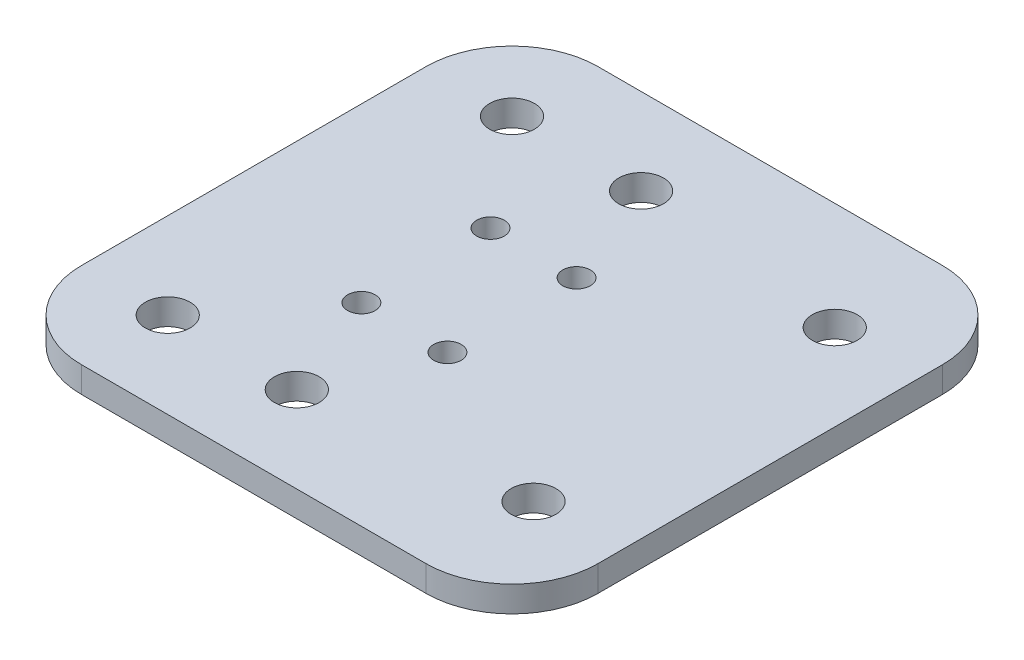
ISO-10303-21;
HEADER;
FILE_DESCRIPTION(('STEP AP214'),'2;1');
FILE_NAME('part.step','',(''),(''),'','','');
FILE_SCHEMA(('AUTOMOTIVE_DESIGN { 1 0 10303 214 1 1 1 1 }'));
ENDSEC;
DATA;
#1=APPLICATION_CONTEXT('core data for automotive mechanical design processes');
#2=APPLICATION_PROTOCOL_DEFINITION('international standard','automotive_design',2000,#1);
#3=PRODUCT_CONTEXT('',#1,'mechanical');
#4=PRODUCT('Part','Part','',(#3));
#5=PRODUCT_RELATED_PRODUCT_CATEGORY('part','',(#4));
#6=PRODUCT_DEFINITION_FORMATION('','',#4);
#7=PRODUCT_DEFINITION_CONTEXT('part definition',#1,'design');
#8=PRODUCT_DEFINITION('design','',#6,#7);
#9=PRODUCT_DEFINITION_SHAPE('','',#8);
#10=(LENGTH_UNIT() NAMED_UNIT(*) SI_UNIT(.MILLI.,.METRE.));
#11=(NAMED_UNIT(*) PLANE_ANGLE_UNIT() SI_UNIT($,.RADIAN.));
#12=(NAMED_UNIT(*) SI_UNIT($,.STERADIAN.) SOLID_ANGLE_UNIT());
#13=UNCERTAINTY_MEASURE_WITH_UNIT(LENGTH_MEASURE(1.E-05),#10,'distance_accuracy_value','');
#14=(GEOMETRIC_REPRESENTATION_CONTEXT(3) GLOBAL_UNCERTAINTY_ASSIGNED_CONTEXT((#13)) GLOBAL_UNIT_ASSIGNED_CONTEXT((#10,
#11,#12)) REPRESENTATION_CONTEXT('',''));
#15=CARTESIAN_POINT('',(0.,0.,0.));
#16=DIRECTION('',(0.,0.,1.));
#17=DIRECTION('',(1.,0.,0.));
#18=AXIS2_PLACEMENT_3D('',#15,#16,#17);
#19=CARTESIAN_POINT('',(0.,3.,-30.));
#20=DIRECTION('',(0.,0.,1.));
#21=DIRECTION('',(1.,0.,0.));
#22=AXIS2_PLACEMENT_3D('',#19,#20,#21);
#23=PLANE('',#22);
#24=DIRECTION('',(-1.,0.,0.));
#25=VECTOR('',#24,1.);
#26=CARTESIAN_POINT('',(21.7157287525381,3.,-30.));
#27=LINE('',#26,#25);
#28=CARTESIAN_POINT('',(50.,3.,-30.));
#29=VERTEX_POINT('',#28);
#30=CARTESIAN_POINT('',(10.,3.,-30.));
#31=VERTEX_POINT('',#30);
#32=EDGE_CURVE('E128',#29,#31,#27,.T.);
#33=ORIENTED_EDGE('',*,*,#32,.F.);
#34=DIRECTION('',(0.,-1.,0.));
#35=VECTOR('',#34,1.);
#36=CARTESIAN_POINT('',(50.,3.,-30.));
#37=LINE('',#36,#35);
#38=CARTESIAN_POINT('',(50.,0.,-30.));
#39=VERTEX_POINT('',#38);
#40=EDGE_CURVE('E154',#29,#39,#37,.T.);
#41=ORIENTED_EDGE('',*,*,#40,.T.);
#42=DIRECTION('',(-1.,0.,0.));
#43=VECTOR('',#42,1.);
#44=CARTESIAN_POINT('',(0.,0.,-30.));
#45=LINE('',#44,#43);
#46=CARTESIAN_POINT('',(10.,0.,-30.));
#47=VERTEX_POINT('',#46);
#48=EDGE_CURVE('E162',#39,#47,#45,.T.);
#49=ORIENTED_EDGE('',*,*,#48,.T.);
#50=DIRECTION('',(0.,-1.,0.));
#51=VECTOR('',#50,1.);
#52=CARTESIAN_POINT('',(10.,3.,-30.));
#53=LINE('',#52,#51);
#54=EDGE_CURVE('E152',#47,#31,#53,.F.);
#55=ORIENTED_EDGE('',*,*,#54,.T.);
#56=EDGE_LOOP('',(#33,#41,#49,#55));
#57=FACE_BOUND('',#56,.T.);
#58=ADVANCED_FACE('F37',(#57),#23,.F.);
#59=CARTESIAN_POINT('',(0.,3.,30.));
#60=DIRECTION('',(1.,0.,0.));
#61=DIRECTION('',(0.,0.,-1.));
#62=AXIS2_PLACEMENT_3D('',#59,#60,#61);
#63=PLANE('',#62);
#64=DIRECTION('',(0.,0.,1.));
#65=VECTOR('',#64,1.);
#66=CARTESIAN_POINT('',(0.,0.,30.));
#67=LINE('',#66,#65);
#68=CARTESIAN_POINT('',(0.,0.,-20.));
#69=VERTEX_POINT('',#68);
#70=CARTESIAN_POINT('',(0.,0.,20.));
#71=VERTEX_POINT('',#70);
#72=EDGE_CURVE('E133',#69,#71,#67,.T.);
#73=ORIENTED_EDGE('',*,*,#72,.T.);
#74=DIRECTION('',(0.,-1.,0.));
#75=VECTOR('',#74,1.);
#76=CARTESIAN_POINT('',(0.,3.,20.));
#77=LINE('',#76,#75);
#78=CARTESIAN_POINT('',(0.,3.,20.));
#79=VERTEX_POINT('',#78);
#80=EDGE_CURVE('E11',#71,#79,#77,.F.);
#81=ORIENTED_EDGE('',*,*,#80,.T.);
#82=DIRECTION('',(0.,0.,1.));
#83=VECTOR('',#82,1.);
#84=CARTESIAN_POINT('',(0.,3.,30.));
#85=LINE('',#84,#83);
#86=CARTESIAN_POINT('',(0.,3.,-20.));
#87=VERTEX_POINT('',#86);
#88=EDGE_CURVE('E131',#87,#79,#85,.T.);
#89=ORIENTED_EDGE('',*,*,#88,.F.);
#90=DIRECTION('',(0.,-1.,0.));
#91=VECTOR('',#90,1.);
#92=CARTESIAN_POINT('',(0.,3.,-20.));
#93=LINE('',#92,#91);
#94=EDGE_CURVE('E45',#87,#69,#93,.T.);
#95=ORIENTED_EDGE('',*,*,#94,.T.);
#96=EDGE_LOOP('',(#73,#81,#89,#95));
#97=FACE_BOUND('',#96,.T.);
#98=ADVANCED_FACE('F159',(#97),#63,.F.);
#99=CARTESIAN_POINT('',(21.7157287525381,3.,30.));
#100=DIRECTION('',(0.,0.,-1.));
#101=DIRECTION('',(-1.,0.,0.));
#102=AXIS2_PLACEMENT_3D('',#99,#100,#101);
#103=PLANE('',#102);
#104=DIRECTION('',(1.,0.,0.));
#105=VECTOR('',#104,1.);
#106=CARTESIAN_POINT('',(21.7157287525381,0.,30.));
#107=LINE('',#106,#105);
#108=CARTESIAN_POINT('',(10.,0.,30.));
#109=VERTEX_POINT('',#108);
#110=CARTESIAN_POINT('',(50.,0.,30.));
#111=VERTEX_POINT('',#110);
#112=EDGE_CURVE('E129',#109,#111,#107,.T.);
#113=ORIENTED_EDGE('',*,*,#112,.T.);
#114=DIRECTION('',(0.,-1.,0.));
#115=VECTOR('',#114,1.);
#116=CARTESIAN_POINT('',(50.,3.,30.));
#117=LINE('',#116,#115);
#118=CARTESIAN_POINT('',(50.,3.,30.));
#119=VERTEX_POINT('',#118);
#120=EDGE_CURVE('E107',#111,#119,#117,.F.);
#121=ORIENTED_EDGE('',*,*,#120,.T.);
#122=DIRECTION('',(1.,0.,0.));
#123=VECTOR('',#122,1.);
#124=CARTESIAN_POINT('',(0.,3.,30.));
#125=LINE('',#124,#123);
#126=CARTESIAN_POINT('',(10.,3.,30.));
#127=VERTEX_POINT('',#126);
#128=EDGE_CURVE('E167',#127,#119,#125,.T.);
#129=ORIENTED_EDGE('',*,*,#128,.F.);
#130=DIRECTION('',(0.,-1.,0.));
#131=VECTOR('',#130,1.);
#132=CARTESIAN_POINT('',(10.,3.,30.));
#133=LINE('',#132,#131);
#134=EDGE_CURVE('E112',#127,#109,#133,.T.);
#135=ORIENTED_EDGE('',*,*,#134,.T.);
#136=EDGE_LOOP('',(#113,#121,#129,#135));
#137=FACE_BOUND('',#136,.T.);
#138=ADVANCED_FACE('F251',(#137),#103,.F.);
#139=CARTESIAN_POINT('',(60.,3.,-30.));
#140=DIRECTION('',(-1.,0.,0.));
#141=DIRECTION('',(0.,0.,1.));
#142=AXIS2_PLACEMENT_3D('',#139,#140,#141);
#143=PLANE('',#142);
#144=DIRECTION('',(0.,0.,-1.));
#145=VECTOR('',#144,1.);
#146=CARTESIAN_POINT('',(60.,3.,-30.));
#147=LINE('',#146,#145);
#148=CARTESIAN_POINT('',(60.,3.,20.));
#149=VERTEX_POINT('',#148);
#150=CARTESIAN_POINT('',(60.,3.,-20.));
#151=VERTEX_POINT('',#150);
#152=EDGE_CURVE('E122',#149,#151,#147,.T.);
#153=ORIENTED_EDGE('',*,*,#152,.F.);
#154=DIRECTION('',(0.,-1.,0.));
#155=VECTOR('',#154,1.);
#156=CARTESIAN_POINT('',(60.,3.,20.));
#157=LINE('',#156,#155);
#158=CARTESIAN_POINT('',(60.,0.,20.));
#159=VERTEX_POINT('',#158);
#160=EDGE_CURVE('E106',#149,#159,#157,.T.);
#161=ORIENTED_EDGE('',*,*,#160,.T.);
#162=DIRECTION('',(0.,0.,-1.));
#163=VECTOR('',#162,1.);
#164=CARTESIAN_POINT('',(60.,0.,-30.));
#165=LINE('',#164,#163);
#166=CARTESIAN_POINT('',(60.,0.,-20.));
#167=VERTEX_POINT('',#166);
#168=EDGE_CURVE('E119',#159,#167,#165,.T.);
#169=ORIENTED_EDGE('',*,*,#168,.T.);
#170=DIRECTION('',(0.,-1.,0.));
#171=VECTOR('',#170,1.);
#172=CARTESIAN_POINT('',(60.,3.,-20.));
#173=LINE('',#172,#171);
#174=EDGE_CURVE('E124',#167,#151,#173,.F.);
#175=ORIENTED_EDGE('',*,*,#174,.T.);
#176=EDGE_LOOP('',(#153,#161,#169,#175));
#177=FACE_BOUND('',#176,.T.);
#178=ADVANCED_FACE('F118',(#177),#143,.F.);
#179=CARTESIAN_POINT('',(0.,3.,0.));
#180=DIRECTION('',(0.,-1.,0.));
#181=DIRECTION('',(0.,0.,-1.));
#182=AXIS2_PLACEMENT_3D('',#179,#180,#181);
#183=PLANE('',#182);
#184=CARTESIAN_POINT('',(25.,3.,20.));
#185=DIRECTION('',(0.,1.,0.));
#186=DIRECTION('',(0.,0.,1.));
#187=AXIS2_PLACEMENT_3D('',#184,#185,#186);
#188=CIRCLE('',#187,2.6);
#189=CARTESIAN_POINT('',(25.,3.,22.6));
#190=VERTEX_POINT('',#189);
#191=EDGE_CURVE('E201',#190,#190,#188,.T.);
#192=ORIENTED_EDGE('',*,*,#191,.F.);
#193=EDGE_LOOP('',(#192));
#194=FACE_BOUND('',#193,.T.);
#195=CARTESIAN_POINT('',(25.,3.,-20.));
#196=DIRECTION('',(0.,1.,0.));
#197=DIRECTION('',(0.,0.,1.));
#198=AXIS2_PLACEMENT_3D('',#195,#196,#197);
#199=CIRCLE('',#198,2.6);
#200=CARTESIAN_POINT('',(25.,3.,-17.4));
#201=VERTEX_POINT('',#200);
#202=EDGE_CURVE('E208',#201,#201,#199,.T.);
#203=ORIENTED_EDGE('',*,*,#202,.F.);
#204=EDGE_LOOP('',(#203));
#205=FACE_BOUND('',#204,.T.);
#206=CARTESIAN_POINT('',(10.,3.,20.));
#207=DIRECTION('',(0.,1.,0.));
#208=DIRECTION('',(0.,0.,1.));
#209=AXIS2_PLACEMENT_3D('',#206,#207,#208);
#210=CIRCLE('',#209,2.6);
#211=CARTESIAN_POINT('',(10.,3.,22.6));
#212=VERTEX_POINT('',#211);
#213=EDGE_CURVE('E214',#212,#212,#210,.T.);
#214=ORIENTED_EDGE('',*,*,#213,.F.);
#215=EDGE_LOOP('',(#214));
#216=FACE_BOUND('',#215,.T.);
#217=CARTESIAN_POINT('',(10.,3.,-20.));
#218=DIRECTION('',(0.,1.,0.));
#219=DIRECTION('',(0.,0.,1.));
#220=AXIS2_PLACEMENT_3D('',#217,#218,#219);
#221=CIRCLE('',#220,2.6);
#222=CARTESIAN_POINT('',(10.,3.,-17.4));
#223=VERTEX_POINT('',#222);
#224=EDGE_CURVE('E220',#223,#223,#221,.T.);
#225=ORIENTED_EDGE('',*,*,#224,.F.);
#226=EDGE_LOOP('',(#225));
#227=FACE_BOUND('',#226,.T.);
#228=CARTESIAN_POINT('',(30.,3.,-7.5));
#229=DIRECTION('',(0.,1.,0.));
#230=DIRECTION('',(0.,0.,1.));
#231=AXIS2_PLACEMENT_3D('',#228,#229,#230);
#232=CIRCLE('',#231,1.6);
#233=CARTESIAN_POINT('',(30.,3.,-5.9));
#234=VERTEX_POINT('',#233);
#235=EDGE_CURVE('E184',#234,#234,#232,.T.);
#236=ORIENTED_EDGE('',*,*,#235,.F.);
#237=EDGE_LOOP('',(#236));
#238=FACE_BOUND('',#237,.T.);
#239=CARTESIAN_POINT('',(30.,3.,7.5));
#240=DIRECTION('',(0.,1.,0.));
#241=DIRECTION('',(0.,0.,-1.));
#242=AXIS2_PLACEMENT_3D('',#239,#240,#241);
#243=CIRCLE('',#242,1.6);
#244=CARTESIAN_POINT('',(30.,3.,5.9));
#245=VERTEX_POINT('',#244);
#246=EDGE_CURVE('E177',#245,#245,#243,.T.);
#247=ORIENTED_EDGE('',*,*,#246,.F.);
#248=EDGE_LOOP('',(#247));
#249=FACE_BOUND('',#248,.T.);
#250=CARTESIAN_POINT('',(20.,3.,7.5));
#251=DIRECTION('',(0.,1.,0.));
#252=DIRECTION('',(0.,0.,-1.));
#253=AXIS2_PLACEMENT_3D('',#250,#251,#252);
#254=CIRCLE('',#253,1.6);
#255=CARTESIAN_POINT('',(20.,3.,5.9));
#256=VERTEX_POINT('',#255);
#257=EDGE_CURVE('E196',#256,#256,#254,.T.);
#258=ORIENTED_EDGE('',*,*,#257,.F.);
#259=EDGE_LOOP('',(#258));
#260=FACE_BOUND('',#259,.T.);
#261=CARTESIAN_POINT('',(50.,3.,-17.5));
#262=DIRECTION('',(0.,1.,0.));
#263=DIRECTION('',(0.,0.,1.));
#264=AXIS2_PLACEMENT_3D('',#261,#262,#263);
#265=CIRCLE('',#264,2.6);
#266=CARTESIAN_POINT('',(50.,3.,-14.9));
#267=VERTEX_POINT('',#266);
#268=EDGE_CURVE('E189',#267,#267,#265,.T.);
#269=ORIENTED_EDGE('',*,*,#268,.F.);
#270=EDGE_LOOP('',(#269));
#271=FACE_BOUND('',#270,.T.);
#272=CARTESIAN_POINT('',(50.,3.,17.5));
#273=DIRECTION('',(0.,1.,0.));
#274=DIRECTION('',(0.,0.,1.));
#275=AXIS2_PLACEMENT_3D('',#272,#273,#274);
#276=CIRCLE('',#275,2.6);
#277=CARTESIAN_POINT('',(50.,3.,20.1));
#278=VERTEX_POINT('',#277);
#279=EDGE_CURVE('E225',#278,#278,#276,.T.);
#280=ORIENTED_EDGE('',*,*,#279,.F.);
#281=EDGE_LOOP('',(#280));
#282=FACE_BOUND('',#281,.T.);
#283=CARTESIAN_POINT('',(20.,3.,-7.5));
#284=DIRECTION('',(0.,1.,0.));
#285=DIRECTION('',(0.,0.,1.));
#286=AXIS2_PLACEMENT_3D('',#283,#284,#285);
#287=CIRCLE('',#286,1.6);
#288=CARTESIAN_POINT('',(20.,3.,-5.9));
#289=VERTEX_POINT('',#288);
#290=EDGE_CURVE('E171',#289,#289,#287,.T.);
#291=ORIENTED_EDGE('',*,*,#290,.F.);
#292=EDGE_LOOP('',(#291));
#293=FACE_BOUND('',#292,.T.);
#294=ORIENTED_EDGE('',*,*,#128,.T.);
#295=CARTESIAN_POINT('',(50.,3.,20.));
#296=DIRECTION('',(0.,-1.,0.));
#297=DIRECTION('',(0.,0.,-1.));
#298=AXIS2_PLACEMENT_3D('',#295,#296,#297);
#299=CIRCLE('',#298,10.);
#300=EDGE_CURVE('E150',#119,#149,#299,.F.);
#301=ORIENTED_EDGE('',*,*,#300,.T.);
#302=ORIENTED_EDGE('',*,*,#152,.T.);
#303=CARTESIAN_POINT('',(50.,3.,-20.));
#304=DIRECTION('',(0.,-1.,0.));
#305=DIRECTION('',(0.,0.,-1.));
#306=AXIS2_PLACEMENT_3D('',#303,#304,#305);
#307=CIRCLE('',#306,10.);
#308=EDGE_CURVE('E148',#151,#29,#307,.F.);
#309=ORIENTED_EDGE('',*,*,#308,.T.);
#310=ORIENTED_EDGE('',*,*,#32,.T.);
#311=CARTESIAN_POINT('',(10.,3.,-20.));
#312=DIRECTION('',(0.,-1.,0.));
#313=DIRECTION('',(0.,0.,-1.));
#314=AXIS2_PLACEMENT_3D('',#311,#312,#313);
#315=CIRCLE('',#314,10.);
#316=EDGE_CURVE('E57',#31,#87,#315,.F.);
#317=ORIENTED_EDGE('',*,*,#316,.T.);
#318=ORIENTED_EDGE('',*,*,#88,.T.);
#319=CARTESIAN_POINT('',(10.,3.,20.));
#320=DIRECTION('',(0.,-1.,0.));
#321=DIRECTION('',(0.,0.,-1.));
#322=AXIS2_PLACEMENT_3D('',#319,#320,#321);
#323=CIRCLE('',#322,10.);
#324=EDGE_CURVE('E146',#79,#127,#323,.F.);
#325=ORIENTED_EDGE('',*,*,#324,.T.);
#326=EDGE_LOOP('',(#294,#301,#302,#309,#310,#317,#318,#325));
#327=FACE_BOUND('',#326,.T.);
#328=ADVANCED_FACE('F241',(#194,#205,#216,#227,#238,#249,#260,#271,#282,#293,#327),#183,.F.);
#329=CARTESIAN_POINT('',(0.,0.,0.));
#330=DIRECTION('',(0.,-1.,0.));
#331=DIRECTION('',(0.,0.,-1.));
#332=AXIS2_PLACEMENT_3D('',#329,#330,#331);
#333=PLANE('',#332);
#334=CARTESIAN_POINT('',(25.,0.,20.));
#335=DIRECTION('',(0.,1.,0.));
#336=DIRECTION('',(0.,0.,1.));
#337=AXIS2_PLACEMENT_3D('',#334,#335,#336);
#338=CIRCLE('',#337,2.6);
#339=CARTESIAN_POINT('',(25.,0.,22.6));
#340=VERTEX_POINT('',#339);
#341=EDGE_CURVE('E204',#340,#340,#338,.T.);
#342=ORIENTED_EDGE('',*,*,#341,.T.);
#343=EDGE_LOOP('',(#342));
#344=FACE_BOUND('',#343,.T.);
#345=CARTESIAN_POINT('',(25.,0.,-20.));
#346=DIRECTION('',(0.,1.,0.));
#347=DIRECTION('',(0.,0.,1.));
#348=AXIS2_PLACEMENT_3D('',#345,#346,#347);
#349=CIRCLE('',#348,2.6);
#350=CARTESIAN_POINT('',(25.,0.,-17.4));
#351=VERTEX_POINT('',#350);
#352=EDGE_CURVE('E211',#351,#351,#349,.T.);
#353=ORIENTED_EDGE('',*,*,#352,.T.);
#354=EDGE_LOOP('',(#353));
#355=FACE_BOUND('',#354,.T.);
#356=CARTESIAN_POINT('',(10.,0.,20.));
#357=DIRECTION('',(0.,1.,0.));
#358=DIRECTION('',(0.,0.,1.));
#359=AXIS2_PLACEMENT_3D('',#356,#357,#358);
#360=CIRCLE('',#359,2.6);
#361=CARTESIAN_POINT('',(10.,0.,22.6));
#362=VERTEX_POINT('',#361);
#363=EDGE_CURVE('E217',#362,#362,#360,.T.);
#364=ORIENTED_EDGE('',*,*,#363,.T.);
#365=EDGE_LOOP('',(#364));
#366=FACE_BOUND('',#365,.T.);
#367=CARTESIAN_POINT('',(10.,0.,-20.));
#368=DIRECTION('',(0.,1.,0.));
#369=DIRECTION('',(0.,0.,1.));
#370=AXIS2_PLACEMENT_3D('',#367,#368,#369);
#371=CIRCLE('',#370,2.6);
#372=CARTESIAN_POINT('',(10.,0.,-17.4));
#373=VERTEX_POINT('',#372);
#374=EDGE_CURVE('E193',#373,#373,#371,.T.);
#375=ORIENTED_EDGE('',*,*,#374,.T.);
#376=EDGE_LOOP('',(#375));
#377=FACE_BOUND('',#376,.T.);
#378=CARTESIAN_POINT('',(30.,0.,-7.5));
#379=DIRECTION('',(0.,1.,0.));
#380=DIRECTION('',(0.,0.,1.));
#381=AXIS2_PLACEMENT_3D('',#378,#379,#380);
#382=CIRCLE('',#381,1.6);
#383=CARTESIAN_POINT('',(30.,0.,-5.9));
#384=VERTEX_POINT('',#383);
#385=EDGE_CURVE('E174',#384,#384,#382,.T.);
#386=ORIENTED_EDGE('',*,*,#385,.T.);
#387=EDGE_LOOP('',(#386));
#388=FACE_BOUND('',#387,.T.);
#389=CARTESIAN_POINT('',(30.,0.,7.5));
#390=DIRECTION('',(0.,1.,0.));
#391=DIRECTION('',(0.,0.,-1.));
#392=AXIS2_PLACEMENT_3D('',#389,#390,#391);
#393=CIRCLE('',#392,1.6);
#394=CARTESIAN_POINT('',(30.,0.,5.9));
#395=VERTEX_POINT('',#394);
#396=EDGE_CURVE('E180',#395,#395,#393,.T.);
#397=ORIENTED_EDGE('',*,*,#396,.T.);
#398=EDGE_LOOP('',(#397));
#399=FACE_BOUND('',#398,.T.);
#400=CARTESIAN_POINT('',(20.,0.,7.5));
#401=DIRECTION('',(0.,1.,0.));
#402=DIRECTION('',(0.,0.,-1.));
#403=AXIS2_PLACEMENT_3D('',#400,#401,#402);
#404=CIRCLE('',#403,1.6);
#405=CARTESIAN_POINT('',(20.,0.,5.9));
#406=VERTEX_POINT('',#405);
#407=EDGE_CURVE('E181',#406,#406,#404,.T.);
#408=ORIENTED_EDGE('',*,*,#407,.T.);
#409=EDGE_LOOP('',(#408));
#410=FACE_BOUND('',#409,.T.);
#411=CARTESIAN_POINT('',(50.,0.,-17.5));
#412=DIRECTION('',(0.,1.,0.));
#413=DIRECTION('',(0.,0.,1.));
#414=AXIS2_PLACEMENT_3D('',#411,#412,#413);
#415=CIRCLE('',#414,2.6);
#416=CARTESIAN_POINT('',(50.,0.,-14.9));
#417=VERTEX_POINT('',#416);
#418=EDGE_CURVE('E192',#417,#417,#415,.T.);
#419=ORIENTED_EDGE('',*,*,#418,.T.);
#420=EDGE_LOOP('',(#419));
#421=FACE_BOUND('',#420,.T.);
#422=CARTESIAN_POINT('',(50.,0.,17.5));
#423=DIRECTION('',(0.,1.,0.));
#424=DIRECTION('',(0.,0.,1.));
#425=AXIS2_PLACEMENT_3D('',#422,#423,#424);
#426=CIRCLE('',#425,2.6);
#427=CARTESIAN_POINT('',(50.,0.,20.1));
#428=VERTEX_POINT('',#427);
#429=EDGE_CURVE('E205',#428,#428,#426,.T.);
#430=ORIENTED_EDGE('',*,*,#429,.T.);
#431=EDGE_LOOP('',(#430));
#432=FACE_BOUND('',#431,.T.);
#433=CARTESIAN_POINT('',(20.,0.,-7.5));
#434=DIRECTION('',(0.,1.,0.));
#435=DIRECTION('',(0.,0.,1.));
#436=AXIS2_PLACEMENT_3D('',#433,#434,#435);
#437=CIRCLE('',#436,1.6);
#438=CARTESIAN_POINT('',(20.,0.,-5.9));
#439=VERTEX_POINT('',#438);
#440=EDGE_CURVE('E163',#439,#439,#437,.T.);
#441=ORIENTED_EDGE('',*,*,#440,.T.);
#442=EDGE_LOOP('',(#441));
#443=FACE_BOUND('',#442,.T.);
#444=ORIENTED_EDGE('',*,*,#168,.F.);
#445=CARTESIAN_POINT('',(50.,0.,20.));
#446=DIRECTION('',(0.,-1.,0.));
#447=DIRECTION('',(0.,0.,-1.));
#448=AXIS2_PLACEMENT_3D('',#445,#446,#447);
#449=CIRCLE('',#448,10.);
#450=EDGE_CURVE('E102',#159,#111,#449,.T.);
#451=ORIENTED_EDGE('',*,*,#450,.T.);
#452=ORIENTED_EDGE('',*,*,#112,.F.);
#453=CARTESIAN_POINT('',(10.,0.,20.));
#454=DIRECTION('',(0.,-1.,0.));
#455=DIRECTION('',(0.,0.,-1.));
#456=AXIS2_PLACEMENT_3D('',#453,#454,#455);
#457=CIRCLE('',#456,10.);
#458=EDGE_CURVE('E139',#109,#71,#457,.T.);
#459=ORIENTED_EDGE('',*,*,#458,.T.);
#460=ORIENTED_EDGE('',*,*,#72,.F.);
#461=CARTESIAN_POINT('',(10.,0.,-20.));
#462=DIRECTION('',(0.,-1.,0.));
#463=DIRECTION('',(0.,0.,-1.));
#464=AXIS2_PLACEMENT_3D('',#461,#462,#463);
#465=CIRCLE('',#464,10.);
#466=EDGE_CURVE('E123',#69,#47,#465,.T.);
#467=ORIENTED_EDGE('',*,*,#466,.T.);
#468=ORIENTED_EDGE('',*,*,#48,.F.);
#469=CARTESIAN_POINT('',(50.,0.,-20.));
#470=DIRECTION('',(0.,-1.,0.));
#471=DIRECTION('',(0.,0.,-1.));
#472=AXIS2_PLACEMENT_3D('',#469,#470,#471);
#473=CIRCLE('',#472,10.);
#474=EDGE_CURVE('E113',#39,#167,#473,.T.);
#475=ORIENTED_EDGE('',*,*,#474,.T.);
#476=EDGE_LOOP('',(#444,#451,#452,#459,#460,#467,#468,#475));
#477=FACE_BOUND('',#476,.T.);
#478=ADVANCED_FACE('F126',(#344,#355,#366,#377,#388,#399,#410,#421,#432,#443,#477),#333,.T.);
#479=CARTESIAN_POINT('',(20.,0.,-7.5));
#480=DIRECTION('',(0.,1.,0.));
#481=DIRECTION('',(0.,0.,1.));
#482=AXIS2_PLACEMENT_3D('',#479,#480,#481);
#483=CYLINDRICAL_SURFACE('',#482,1.6);
#484=ORIENTED_EDGE('',*,*,#440,.F.);
#485=EDGE_LOOP('',(#484));
#486=FACE_BOUND('',#485,.T.);
#487=ORIENTED_EDGE('',*,*,#290,.T.);
#488=EDGE_LOOP('',(#487));
#489=FACE_BOUND('',#488,.T.);
#490=ADVANCED_FACE('F237',(#486,#489),#483,.F.);
#491=CARTESIAN_POINT('',(50.,0.,17.5));
#492=DIRECTION('',(0.,1.,0.));
#493=DIRECTION('',(0.,0.,1.));
#494=AXIS2_PLACEMENT_3D('',#491,#492,#493);
#495=CYLINDRICAL_SURFACE('',#494,2.6);
#496=ORIENTED_EDGE('',*,*,#429,.F.);
#497=EDGE_LOOP('',(#496));
#498=FACE_BOUND('',#497,.T.);
#499=ORIENTED_EDGE('',*,*,#279,.T.);
#500=EDGE_LOOP('',(#499));
#501=FACE_BOUND('',#500,.T.);
#502=ADVANCED_FACE('F233',(#498,#501),#495,.F.);
#503=CARTESIAN_POINT('',(50.,0.,-17.5));
#504=DIRECTION('',(0.,1.,0.));
#505=DIRECTION('',(0.,0.,1.));
#506=AXIS2_PLACEMENT_3D('',#503,#504,#505);
#507=CYLINDRICAL_SURFACE('',#506,2.6);
#508=ORIENTED_EDGE('',*,*,#418,.F.);
#509=EDGE_LOOP('',(#508));
#510=FACE_BOUND('',#509,.T.);
#511=ORIENTED_EDGE('',*,*,#268,.T.);
#512=EDGE_LOOP('',(#511));
#513=FACE_BOUND('',#512,.T.);
#514=ADVANCED_FACE('F236',(#510,#513),#507,.F.);
#515=CARTESIAN_POINT('',(20.,0.,7.5));
#516=DIRECTION('',(0.,1.,0.));
#517=DIRECTION('',(0.,0.,1.));
#518=AXIS2_PLACEMENT_3D('',#515,#516,#517);
#519=CYLINDRICAL_SURFACE('',#518,1.6);
#520=ORIENTED_EDGE('',*,*,#407,.F.);
#521=EDGE_LOOP('',(#520));
#522=FACE_BOUND('',#521,.T.);
#523=ORIENTED_EDGE('',*,*,#257,.T.);
#524=EDGE_LOOP('',(#523));
#525=FACE_BOUND('',#524,.T.);
#526=ADVANCED_FACE('F290',(#522,#525),#519,.F.);
#527=CARTESIAN_POINT('',(30.,0.,7.5));
#528=DIRECTION('',(0.,1.,0.));
#529=DIRECTION('',(0.,0.,1.));
#530=AXIS2_PLACEMENT_3D('',#527,#528,#529);
#531=CYLINDRICAL_SURFACE('',#530,1.6);
#532=ORIENTED_EDGE('',*,*,#396,.F.);
#533=EDGE_LOOP('',(#532));
#534=FACE_BOUND('',#533,.T.);
#535=ORIENTED_EDGE('',*,*,#246,.T.);
#536=EDGE_LOOP('',(#535));
#537=FACE_BOUND('',#536,.T.);
#538=ADVANCED_FACE('F293',(#534,#537),#531,.F.);
#539=CARTESIAN_POINT('',(30.,0.,-7.5));
#540=DIRECTION('',(0.,1.,0.));
#541=DIRECTION('',(0.,0.,1.));
#542=AXIS2_PLACEMENT_3D('',#539,#540,#541);
#543=CYLINDRICAL_SURFACE('',#542,1.6);
#544=ORIENTED_EDGE('',*,*,#385,.F.);
#545=EDGE_LOOP('',(#544));
#546=FACE_BOUND('',#545,.T.);
#547=ORIENTED_EDGE('',*,*,#235,.T.);
#548=EDGE_LOOP('',(#547));
#549=FACE_BOUND('',#548,.T.);
#550=ADVANCED_FACE('F298',(#546,#549),#543,.F.);
#551=CARTESIAN_POINT('',(10.,0.,-20.));
#552=DIRECTION('',(0.,1.,0.));
#553=DIRECTION('',(0.,0.,1.));
#554=AXIS2_PLACEMENT_3D('',#551,#552,#553);
#555=CYLINDRICAL_SURFACE('',#554,2.6);
#556=ORIENTED_EDGE('',*,*,#374,.F.);
#557=EDGE_LOOP('',(#556));
#558=FACE_BOUND('',#557,.T.);
#559=ORIENTED_EDGE('',*,*,#224,.T.);
#560=EDGE_LOOP('',(#559));
#561=FACE_BOUND('',#560,.T.);
#562=ADVANCED_FACE('F301',(#558,#561),#555,.F.);
#563=CARTESIAN_POINT('',(10.,0.,20.));
#564=DIRECTION('',(0.,1.,0.));
#565=DIRECTION('',(0.,0.,1.));
#566=AXIS2_PLACEMENT_3D('',#563,#564,#565);
#567=CYLINDRICAL_SURFACE('',#566,2.6);
#568=ORIENTED_EDGE('',*,*,#363,.F.);
#569=EDGE_LOOP('',(#568));
#570=FACE_BOUND('',#569,.T.);
#571=ORIENTED_EDGE('',*,*,#213,.T.);
#572=EDGE_LOOP('',(#571));
#573=FACE_BOUND('',#572,.T.);
#574=ADVANCED_FACE('F283',(#570,#573),#567,.F.);
#575=CARTESIAN_POINT('',(25.,0.,-20.));
#576=DIRECTION('',(0.,1.,0.));
#577=DIRECTION('',(0.,0.,1.));
#578=AXIS2_PLACEMENT_3D('',#575,#576,#577);
#579=CYLINDRICAL_SURFACE('',#578,2.6);
#580=ORIENTED_EDGE('',*,*,#352,.F.);
#581=EDGE_LOOP('',(#580));
#582=FACE_BOUND('',#581,.T.);
#583=ORIENTED_EDGE('',*,*,#202,.T.);
#584=EDGE_LOOP('',(#583));
#585=FACE_BOUND('',#584,.T.);
#586=ADVANCED_FACE('F277',(#582,#585),#579,.F.);
#587=CARTESIAN_POINT('',(25.,0.,20.));
#588=DIRECTION('',(0.,1.,0.));
#589=DIRECTION('',(0.,0.,1.));
#590=AXIS2_PLACEMENT_3D('',#587,#588,#589);
#591=CYLINDRICAL_SURFACE('',#590,2.6);
#592=ORIENTED_EDGE('',*,*,#341,.F.);
#593=EDGE_LOOP('',(#592));
#594=FACE_BOUND('',#593,.T.);
#595=ORIENTED_EDGE('',*,*,#191,.T.);
#596=EDGE_LOOP('',(#595));
#597=FACE_BOUND('',#596,.T.);
#598=ADVANCED_FACE('F273',(#594,#597),#591,.F.);
#599=CARTESIAN_POINT('',(50.,3.,20.));
#600=DIRECTION('',(0.,-1.,0.));
#601=DIRECTION('',(0.,0.,-1.));
#602=AXIS2_PLACEMENT_3D('',#599,#600,#601);
#603=CYLINDRICAL_SURFACE('',#602,10.);
#604=ORIENTED_EDGE('',*,*,#300,.F.);
#605=ORIENTED_EDGE('',*,*,#120,.F.);
#606=ORIENTED_EDGE('',*,*,#450,.F.);
#607=ORIENTED_EDGE('',*,*,#160,.F.);
#608=EDGE_LOOP('',(#604,#605,#606,#607));
#609=FACE_BOUND('',#608,.T.);
#610=ADVANCED_FACE('F105',(#609),#603,.T.);
#611=CARTESIAN_POINT('',(50.,3.,-20.));
#612=DIRECTION('',(0.,-1.,0.));
#613=DIRECTION('',(0.,0.,-1.));
#614=AXIS2_PLACEMENT_3D('',#611,#612,#613);
#615=CYLINDRICAL_SURFACE('',#614,10.);
#616=ORIENTED_EDGE('',*,*,#308,.F.);
#617=ORIENTED_EDGE('',*,*,#174,.F.);
#618=ORIENTED_EDGE('',*,*,#474,.F.);
#619=ORIENTED_EDGE('',*,*,#40,.F.);
#620=EDGE_LOOP('',(#616,#617,#618,#619));
#621=FACE_BOUND('',#620,.T.);
#622=ADVANCED_FACE('F255',(#621),#615,.T.);
#623=CARTESIAN_POINT('',(10.,3.,20.));
#624=DIRECTION('',(0.,-1.,0.));
#625=DIRECTION('',(0.,0.,-1.));
#626=AXIS2_PLACEMENT_3D('',#623,#624,#625);
#627=CYLINDRICAL_SURFACE('',#626,10.);
#628=ORIENTED_EDGE('',*,*,#324,.F.);
#629=ORIENTED_EDGE('',*,*,#80,.F.);
#630=ORIENTED_EDGE('',*,*,#458,.F.);
#631=ORIENTED_EDGE('',*,*,#134,.F.);
#632=EDGE_LOOP('',(#628,#629,#630,#631));
#633=FACE_BOUND('',#632,.T.);
#634=ADVANCED_FACE('F253',(#633),#627,.T.);
#635=CARTESIAN_POINT('',(10.,3.,-20.));
#636=DIRECTION('',(0.,-1.,0.));
#637=DIRECTION('',(0.,0.,-1.));
#638=AXIS2_PLACEMENT_3D('',#635,#636,#637);
#639=CYLINDRICAL_SURFACE('',#638,10.);
#640=ORIENTED_EDGE('',*,*,#316,.F.);
#641=ORIENTED_EDGE('',*,*,#54,.F.);
#642=ORIENTED_EDGE('',*,*,#466,.F.);
#643=ORIENTED_EDGE('',*,*,#94,.F.);
#644=EDGE_LOOP('',(#640,#641,#642,#643));
#645=FACE_BOUND('',#644,.T.);
#646=ADVANCED_FACE('F39',(#645),#639,.T.);
#647=CLOSED_SHELL('',(#58,#98,#138,#178,#328,#478,#490,#502,#514,#526,#538,#550,#562,#574,#586,
#598,#610,#622,#634,#646));
#648=MANIFOLD_SOLID_BREP('B2',#647);
#649=ADVANCED_BREP_SHAPE_REPRESENTATION('',(#18,#648),#14);
#650=SHAPE_DEFINITION_REPRESENTATION(#9,#649);
ENDSEC;
END-ISO-10303-21;
